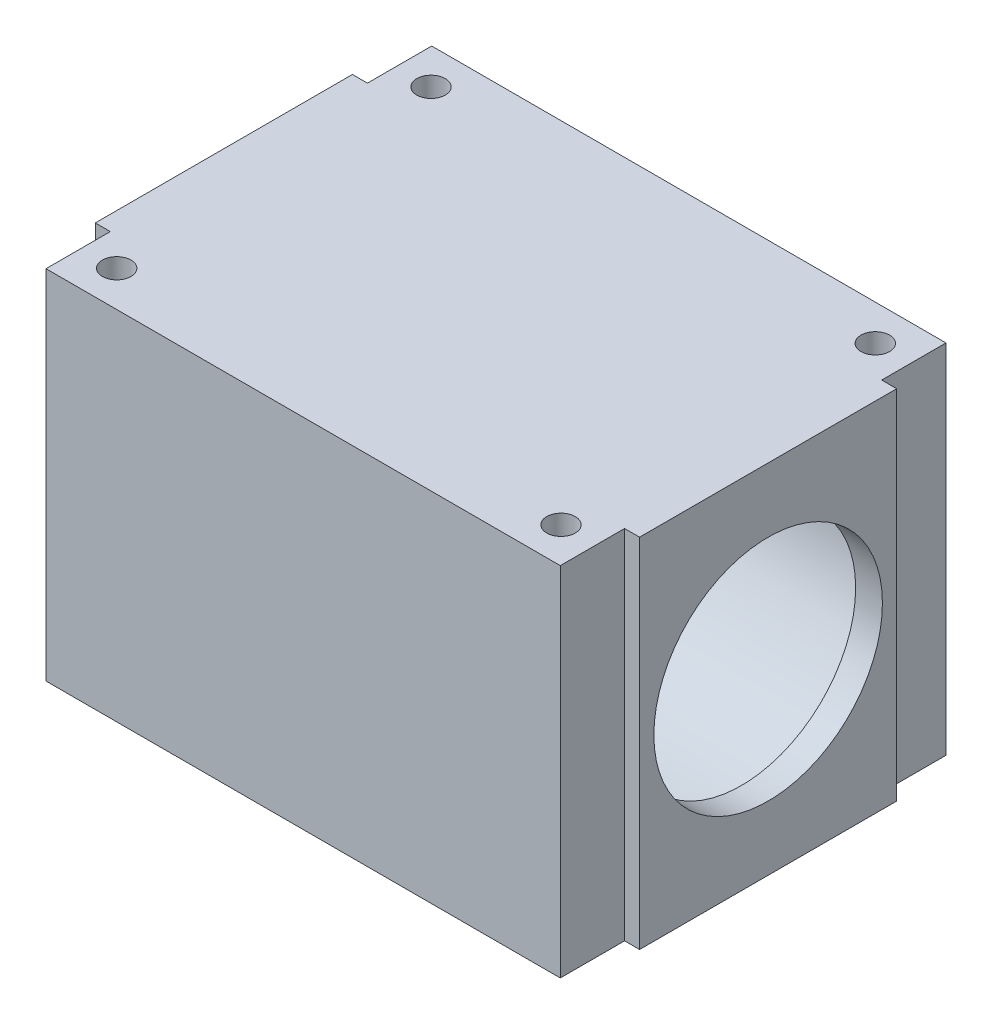
ISO-10303-21;
HEADER;
FILE_DESCRIPTION(('STEP AP214'),'2;1');
FILE_NAME('part.step','',(''),(''),'','','');
FILE_SCHEMA(('AUTOMOTIVE_DESIGN { 1 0 10303 214 1 1 1 1 }'));
ENDSEC;
DATA;
#1=APPLICATION_CONTEXT('core data for automotive mechanical design processes');
#2=APPLICATION_PROTOCOL_DEFINITION('international standard','automotive_design',2000,#1);
#3=PRODUCT_CONTEXT('',#1,'mechanical');
#4=PRODUCT('Part','Part','',(#3));
#5=PRODUCT_RELATED_PRODUCT_CATEGORY('part','',(#4));
#6=PRODUCT_DEFINITION_FORMATION('','',#4);
#7=PRODUCT_DEFINITION_CONTEXT('part definition',#1,'design');
#8=PRODUCT_DEFINITION('design','',#6,#7);
#9=PRODUCT_DEFINITION_SHAPE('','',#8);
#10=(LENGTH_UNIT() NAMED_UNIT(*) SI_UNIT(.MILLI.,.METRE.));
#11=(NAMED_UNIT(*) PLANE_ANGLE_UNIT() SI_UNIT($,.RADIAN.));
#12=(NAMED_UNIT(*) SI_UNIT($,.STERADIAN.) SOLID_ANGLE_UNIT());
#13=UNCERTAINTY_MEASURE_WITH_UNIT(LENGTH_MEASURE(1.E-05),#10,'distance_accuracy_value','');
#14=(GEOMETRIC_REPRESENTATION_CONTEXT(3) GLOBAL_UNCERTAINTY_ASSIGNED_CONTEXT((#13)) GLOBAL_UNIT_ASSIGNED_CONTEXT((#10,
#11,#12)) REPRESENTATION_CONTEXT('',''));
#15=CARTESIAN_POINT('',(0.,0.,0.));
#16=DIRECTION('',(0.,0.,1.));
#17=DIRECTION('',(1.,0.,0.));
#18=AXIS2_PLACEMENT_3D('',#15,#16,#17);
#19=CARTESIAN_POINT('',(68.2,-25.,27.));
#20=DIRECTION('',(0.,0.,-1.));
#21=DIRECTION('',(-1.,0.,0.));
#22=AXIS2_PLACEMENT_3D('',#19,#20,#21);
#23=PLANE('',#22);
#24=DIRECTION('',(0.,1.,0.));
#25=VECTOR('',#24,1.);
#26=CARTESIAN_POINT('',(-1.9,-25.,27.));
#27=LINE('',#26,#25);
#28=CARTESIAN_POINT('',(-1.9,-25.,27.));
#29=VERTEX_POINT('',#28);
#30=CARTESIAN_POINT('',(-1.9,25.,27.));
#31=VERTEX_POINT('',#30);
#32=EDGE_CURVE('E361',#29,#31,#27,.T.);
#33=ORIENTED_EDGE('',*,*,#32,.F.);
#34=DIRECTION('',(-1.,0.,0.));
#35=VECTOR('',#34,1.);
#36=CARTESIAN_POINT('',(68.2,-25.,27.));
#37=LINE('',#36,#35);
#38=CARTESIAN_POINT('',(70.1,-25.,27.));
#39=VERTEX_POINT('',#38);
#40=EDGE_CURVE('E162',#39,#29,#37,.T.);
#41=ORIENTED_EDGE('',*,*,#40,.F.);
#42=DIRECTION('',(0.,-1.,0.));
#43=VECTOR('',#42,1.);
#44=CARTESIAN_POINT('',(70.1,25.,27.));
#45=LINE('',#44,#43);
#46=CARTESIAN_POINT('',(70.1,25.,27.));
#47=VERTEX_POINT('',#46);
#48=EDGE_CURVE('E374',#47,#39,#45,.T.);
#49=ORIENTED_EDGE('',*,*,#48,.F.);
#50=DIRECTION('',(-1.,0.,0.));
#51=VECTOR('',#50,1.);
#52=CARTESIAN_POINT('',(68.2,25.,27.));
#53=LINE('',#52,#51);
#54=EDGE_CURVE('E55',#47,#31,#53,.T.);
#55=ORIENTED_EDGE('',*,*,#54,.T.);
#56=EDGE_LOOP('',(#33,#41,#49,#55));
#57=FACE_BOUND('',#56,.T.);
#58=ADVANCED_FACE('F45',(#57),#23,.F.);
#59=CARTESIAN_POINT('',(0.,0.,0.));
#60=DIRECTION('',(-1.,0.,0.));
#61=DIRECTION('',(0.,0.,1.));
#62=AXIS2_PLACEMENT_3D('',#59,#60,#61);
#63=CYLINDRICAL_SURFACE('',#62,16.);
#64=CARTESIAN_POINT('',(-4.,0.,0.));
#65=DIRECTION('',(-1.,0.,0.));
#66=DIRECTION('',(0.,0.,1.));
#67=AXIS2_PLACEMENT_3D('',#64,#65,#66);
#68=CIRCLE('',#67,16.);
#69=CARTESIAN_POINT('',(-4.,0.,16.));
#70=VERTEX_POINT('',#69);
#71=EDGE_CURVE('E205',#70,#70,#68,.T.);
#72=ORIENTED_EDGE('',*,*,#71,.T.);
#73=EDGE_LOOP('',(#72));
#74=FACE_BOUND('',#73,.T.);
#75=CARTESIAN_POINT('',(-0.25,0.,0.));
#76=DIRECTION('',(1.,0.,0.));
#77=DIRECTION('',(0.,0.,-1.));
#78=AXIS2_PLACEMENT_3D('',#75,#76,#77);
#79=CIRCLE('',#78,16.);
#80=CARTESIAN_POINT('',(-0.25,0.,-16.));
#81=VERTEX_POINT('',#80);
#82=EDGE_CURVE('E49',#81,#81,#79,.T.);
#83=ORIENTED_EDGE('',*,*,#82,.T.);
#84=EDGE_LOOP('',(#83));
#85=FACE_BOUND('',#84,.T.);
#86=ADVANCED_FACE('F313',(#74,#85),#63,.F.);
#87=CARTESIAN_POINT('',(70.2,0.,0.));
#88=DIRECTION('',(-1.,0.,0.));
#89=DIRECTION('',(0.,0.,1.));
#90=AXIS2_PLACEMENT_3D('',#87,#88,#89);
#91=CYLINDRICAL_SURFACE('',#90,16.);
#92=CARTESIAN_POINT('',(72.2,0.,0.));
#93=DIRECTION('',(1.,0.,0.));
#94=DIRECTION('',(0.,0.,-1.));
#95=AXIS2_PLACEMENT_3D('',#92,#93,#94);
#96=CIRCLE('',#95,16.);
#97=CARTESIAN_POINT('',(72.2,0.,-16.));
#98=VERTEX_POINT('',#97);
#99=EDGE_CURVE('E179',#98,#98,#96,.T.);
#100=ORIENTED_EDGE('',*,*,#99,.T.);
#101=EDGE_LOOP('',(#100));
#102=FACE_BOUND('',#101,.T.);
#103=CARTESIAN_POINT('',(68.45,0.,0.));
#104=DIRECTION('',(-1.,0.,0.));
#105=DIRECTION('',(0.,0.,1.));
#106=AXIS2_PLACEMENT_3D('',#103,#104,#105);
#107=CIRCLE('',#106,16.);
#108=CARTESIAN_POINT('',(68.45,0.,16.));
#109=VERTEX_POINT('',#108);
#110=EDGE_CURVE('E176',#109,#109,#107,.T.);
#111=ORIENTED_EDGE('',*,*,#110,.T.);
#112=EDGE_LOOP('',(#111));
#113=FACE_BOUND('',#112,.T.);
#114=ADVANCED_FACE('F319',(#102,#113),#91,.F.);
#115=CARTESIAN_POINT('',(68.2,-25.,-27.));
#116=DIRECTION('',(0.,0.,1.));
#117=DIRECTION('',(1.,0.,0.));
#118=AXIS2_PLACEMENT_3D('',#115,#116,#117);
#119=PLANE('',#118);
#120=DIRECTION('',(-1.,0.,0.));
#121=VECTOR('',#120,1.);
#122=CARTESIAN_POINT('',(68.2,-25.,-27.));
#123=LINE('',#122,#121);
#124=CARTESIAN_POINT('',(70.1,-25.,-27.));
#125=VERTEX_POINT('',#124);
#126=CARTESIAN_POINT('',(-1.9,-25.,-27.));
#127=VERTEX_POINT('',#126);
#128=EDGE_CURVE('E155',#125,#127,#123,.T.);
#129=ORIENTED_EDGE('',*,*,#128,.T.);
#130=DIRECTION('',(0.,-1.,0.));
#131=VECTOR('',#130,1.);
#132=CARTESIAN_POINT('',(-1.9,-25.,-27.));
#133=LINE('',#132,#131);
#134=CARTESIAN_POINT('',(-1.9,25.,-27.));
#135=VERTEX_POINT('',#134);
#136=EDGE_CURVE('E137',#135,#127,#133,.T.);
#137=ORIENTED_EDGE('',*,*,#136,.F.);
#138=DIRECTION('',(-1.,0.,0.));
#139=VECTOR('',#138,1.);
#140=CARTESIAN_POINT('',(68.2,25.,-27.));
#141=LINE('',#140,#139);
#142=CARTESIAN_POINT('',(70.1,25.,-27.));
#143=VERTEX_POINT('',#142);
#144=EDGE_CURVE('E11',#143,#135,#141,.T.);
#145=ORIENTED_EDGE('',*,*,#144,.F.);
#146=DIRECTION('',(0.,1.,0.));
#147=VECTOR('',#146,1.);
#148=CARTESIAN_POINT('',(70.1,25.,-27.));
#149=LINE('',#148,#147);
#150=EDGE_CURVE('E160',#125,#143,#149,.T.);
#151=ORIENTED_EDGE('',*,*,#150,.F.);
#152=EDGE_LOOP('',(#129,#137,#145,#151));
#153=FACE_BOUND('',#152,.T.);
#154=ADVANCED_FACE('F47',(#153),#119,.F.);
#155=CARTESIAN_POINT('',(68.2,25.,27.));
#156=DIRECTION('',(0.,-1.,0.));
#157=DIRECTION('',(0.,0.,-1.));
#158=AXIS2_PLACEMENT_3D('',#155,#156,#157);
#159=PLANE('',#158);
#160=CARTESIAN_POINT('',(3.,25.,-22.));
#161=DIRECTION('',(0.,-1.,0.));
#162=DIRECTION('',(0.,0.,-1.));
#163=AXIS2_PLACEMENT_3D('',#160,#161,#162);
#164=CIRCLE('',#163,2.);
#165=CARTESIAN_POINT('',(3.,25.,-24.));
#166=VERTEX_POINT('',#165);
#167=EDGE_CURVE('E217',#166,#166,#164,.T.);
#168=ORIENTED_EDGE('',*,*,#167,.T.);
#169=EDGE_LOOP('',(#168));
#170=FACE_BOUND('',#169,.T.);
#171=CARTESIAN_POINT('',(65.2,25.,-22.));
#172=DIRECTION('',(0.,-1.,0.));
#173=DIRECTION('',(0.,0.,-1.));
#174=AXIS2_PLACEMENT_3D('',#171,#172,#173);
#175=CIRCLE('',#174,2.);
#176=CARTESIAN_POINT('',(65.2,25.,-24.));
#177=VERTEX_POINT('',#176);
#178=EDGE_CURVE('E231',#177,#177,#175,.T.);
#179=ORIENTED_EDGE('',*,*,#178,.T.);
#180=EDGE_LOOP('',(#179));
#181=FACE_BOUND('',#180,.T.);
#182=CARTESIAN_POINT('',(65.2,25.,22.));
#183=DIRECTION('',(0.,-1.,0.));
#184=DIRECTION('',(0.,0.,-1.));
#185=AXIS2_PLACEMENT_3D('',#182,#183,#184);
#186=CIRCLE('',#185,2.);
#187=CARTESIAN_POINT('',(65.2,25.,20.));
#188=VERTEX_POINT('',#187);
#189=EDGE_CURVE('E223',#188,#188,#186,.T.);
#190=ORIENTED_EDGE('',*,*,#189,.T.);
#191=EDGE_LOOP('',(#190));
#192=FACE_BOUND('',#191,.T.);
#193=CARTESIAN_POINT('',(3.,25.,22.));
#194=DIRECTION('',(0.,-1.,0.));
#195=DIRECTION('',(0.,0.,-1.));
#196=AXIS2_PLACEMENT_3D('',#193,#194,#195);
#197=CIRCLE('',#196,2.);
#198=CARTESIAN_POINT('',(3.,25.,20.));
#199=VERTEX_POINT('',#198);
#200=EDGE_CURVE('E222',#199,#199,#197,.T.);
#201=ORIENTED_EDGE('',*,*,#200,.T.);
#202=EDGE_LOOP('',(#201));
#203=FACE_BOUND('',#202,.T.);
#204=DIRECTION('',(0.,0.,-1.));
#205=VECTOR('',#204,1.);
#206=CARTESIAN_POINT('',(-1.9,25.,-27.));
#207=LINE('',#206,#205);
#208=CARTESIAN_POINT('',(-1.9,25.,-18.));
#209=VERTEX_POINT('',#208);
#210=EDGE_CURVE('E143',#209,#135,#207,.T.);
#211=ORIENTED_EDGE('',*,*,#210,.F.);
#212=DIRECTION('',(-1.,0.,0.));
#213=VECTOR('',#212,1.);
#214=CARTESIAN_POINT('',(-1.9,25.,-18.));
#215=LINE('',#214,#213);
#216=CARTESIAN_POINT('',(-4.,25.,-18.));
#217=VERTEX_POINT('',#216);
#218=EDGE_CURVE('E337',#209,#217,#215,.T.);
#219=ORIENTED_EDGE('',*,*,#218,.T.);
#220=DIRECTION('',(0.,0.,-1.));
#221=VECTOR('',#220,1.);
#222=CARTESIAN_POINT('',(-4.,25.,-27.));
#223=LINE('',#222,#221);
#224=CARTESIAN_POINT('',(-4.,25.,18.));
#225=VERTEX_POINT('',#224);
#226=EDGE_CURVE('E209',#225,#217,#223,.T.);
#227=ORIENTED_EDGE('',*,*,#226,.F.);
#228=DIRECTION('',(-1.,0.,0.));
#229=VECTOR('',#228,1.);
#230=CARTESIAN_POINT('',(-1.9,25.,18.));
#231=LINE('',#230,#229);
#232=CARTESIAN_POINT('',(-1.9,25.,18.));
#233=VERTEX_POINT('',#232);
#234=EDGE_CURVE('E71',#233,#225,#231,.T.);
#235=ORIENTED_EDGE('',*,*,#234,.F.);
#236=DIRECTION('',(0.,0.,-1.));
#237=VECTOR('',#236,1.);
#238=CARTESIAN_POINT('',(-1.9,25.,27.));
#239=LINE('',#238,#237);
#240=EDGE_CURVE('E368',#31,#233,#239,.T.);
#241=ORIENTED_EDGE('',*,*,#240,.F.);
#242=ORIENTED_EDGE('',*,*,#54,.F.);
#243=DIRECTION('',(0.,0.,1.));
#244=VECTOR('',#243,1.);
#245=CARTESIAN_POINT('',(70.1,25.,27.));
#246=LINE('',#245,#244);
#247=CARTESIAN_POINT('',(70.1,25.,18.));
#248=VERTEX_POINT('',#247);
#249=EDGE_CURVE('E386',#248,#47,#246,.T.);
#250=ORIENTED_EDGE('',*,*,#249,.F.);
#251=DIRECTION('',(1.,0.,0.));
#252=VECTOR('',#251,1.);
#253=CARTESIAN_POINT('',(70.1,25.,18.));
#254=LINE('',#253,#252);
#255=CARTESIAN_POINT('',(72.2,25.,18.));
#256=VERTEX_POINT('',#255);
#257=EDGE_CURVE('E393',#248,#256,#254,.T.);
#258=ORIENTED_EDGE('',*,*,#257,.T.);
#259=DIRECTION('',(0.,0.,1.));
#260=VECTOR('',#259,1.);
#261=CARTESIAN_POINT('',(72.2,25.,27.));
#262=LINE('',#261,#260);
#263=CARTESIAN_POINT('',(72.2,25.,-18.));
#264=VERTEX_POINT('',#263);
#265=EDGE_CURVE('E186',#264,#256,#262,.T.);
#266=ORIENTED_EDGE('',*,*,#265,.F.);
#267=DIRECTION('',(1.,0.,0.));
#268=VECTOR('',#267,1.);
#269=CARTESIAN_POINT('',(70.1,25.,-18.));
#270=LINE('',#269,#268);
#271=CARTESIAN_POINT('',(70.1,25.,-18.));
#272=VERTEX_POINT('',#271);
#273=EDGE_CURVE('E399',#272,#264,#270,.T.);
#274=ORIENTED_EDGE('',*,*,#273,.F.);
#275=DIRECTION('',(0.,0.,1.));
#276=VECTOR('',#275,1.);
#277=CARTESIAN_POINT('',(70.1,25.,-27.));
#278=LINE('',#277,#276);
#279=EDGE_CURVE('E414',#143,#272,#278,.T.);
#280=ORIENTED_EDGE('',*,*,#279,.F.);
#281=ORIENTED_EDGE('',*,*,#144,.T.);
#282=EDGE_LOOP('',(#211,#219,#227,#235,#241,#242,#250,#258,#266,#274,#280,#281));
#283=FACE_BOUND('',#282,.T.);
#284=ADVANCED_FACE('F286',(#170,#181,#192,#203,#283),#159,.F.);
#285=CARTESIAN_POINT('',(68.2,-25.,27.));
#286=DIRECTION('',(0.,1.,0.));
#287=DIRECTION('',(0.,0.,1.));
#288=AXIS2_PLACEMENT_3D('',#285,#286,#287);
#289=PLANE('',#288);
#290=CARTESIAN_POINT('',(3.,-25.,-22.));
#291=DIRECTION('',(0.,-1.,0.));
#292=DIRECTION('',(0.,0.,-1.));
#293=AXIS2_PLACEMENT_3D('',#290,#291,#292);
#294=CIRCLE('',#293,2.);
#295=CARTESIAN_POINT('',(3.,-25.,-24.));
#296=VERTEX_POINT('',#295);
#297=EDGE_CURVE('E266',#296,#296,#294,.T.);
#298=ORIENTED_EDGE('',*,*,#297,.F.);
#299=EDGE_LOOP('',(#298));
#300=FACE_BOUND('',#299,.T.);
#301=CARTESIAN_POINT('',(65.2,-25.,-22.));
#302=DIRECTION('',(0.,-1.,0.));
#303=DIRECTION('',(0.,0.,-1.));
#304=AXIS2_PLACEMENT_3D('',#301,#302,#303);
#305=CIRCLE('',#304,2.);
#306=CARTESIAN_POINT('',(65.2,-25.,-24.));
#307=VERTEX_POINT('',#306);
#308=EDGE_CURVE('E258',#307,#307,#305,.T.);
#309=ORIENTED_EDGE('',*,*,#308,.F.);
#310=EDGE_LOOP('',(#309));
#311=FACE_BOUND('',#310,.T.);
#312=CARTESIAN_POINT('',(65.2,-25.,22.));
#313=DIRECTION('',(0.,-1.,0.));
#314=DIRECTION('',(0.,0.,-1.));
#315=AXIS2_PLACEMENT_3D('',#312,#313,#314);
#316=CIRCLE('',#315,2.);
#317=CARTESIAN_POINT('',(65.2,-25.,20.));
#318=VERTEX_POINT('',#317);
#319=EDGE_CURVE('E250',#318,#318,#316,.T.);
#320=ORIENTED_EDGE('',*,*,#319,.F.);
#321=EDGE_LOOP('',(#320));
#322=FACE_BOUND('',#321,.T.);
#323=CARTESIAN_POINT('',(3.,-25.,22.));
#324=DIRECTION('',(0.,-1.,0.));
#325=DIRECTION('',(0.,0.,-1.));
#326=AXIS2_PLACEMENT_3D('',#323,#324,#325);
#327=CIRCLE('',#326,2.);
#328=CARTESIAN_POINT('',(3.,-25.,20.));
#329=VERTEX_POINT('',#328);
#330=EDGE_CURVE('E170',#329,#329,#327,.T.);
#331=ORIENTED_EDGE('',*,*,#330,.F.);
#332=EDGE_LOOP('',(#331));
#333=FACE_BOUND('',#332,.T.);
#334=DIRECTION('',(0.,0.,1.));
#335=VECTOR('',#334,1.);
#336=CARTESIAN_POINT('',(-4.,-25.,-27.));
#337=LINE('',#336,#335);
#338=CARTESIAN_POINT('',(-4.,-25.,-18.));
#339=VERTEX_POINT('',#338);
#340=CARTESIAN_POINT('',(-4.,-25.,18.));
#341=VERTEX_POINT('',#340);
#342=EDGE_CURVE('E213',#339,#341,#337,.T.);
#343=ORIENTED_EDGE('',*,*,#342,.F.);
#344=DIRECTION('',(-1.,0.,0.));
#345=VECTOR('',#344,1.);
#346=CARTESIAN_POINT('',(-1.9,-25.,-18.));
#347=LINE('',#346,#345);
#348=CARTESIAN_POINT('',(-1.9,-25.,-18.));
#349=VERTEX_POINT('',#348);
#350=EDGE_CURVE('E63',#349,#339,#347,.T.);
#351=ORIENTED_EDGE('',*,*,#350,.F.);
#352=DIRECTION('',(0.,0.,1.));
#353=VECTOR('',#352,1.);
#354=CARTESIAN_POINT('',(-1.9,-25.,-27.));
#355=LINE('',#354,#353);
#356=EDGE_CURVE('E141',#127,#349,#355,.T.);
#357=ORIENTED_EDGE('',*,*,#356,.F.);
#358=ORIENTED_EDGE('',*,*,#128,.F.);
#359=DIRECTION('',(0.,0.,-1.));
#360=VECTOR('',#359,1.);
#361=CARTESIAN_POINT('',(70.1,-25.,-27.));
#362=LINE('',#361,#360);
#363=CARTESIAN_POINT('',(70.1,-25.,-18.));
#364=VERTEX_POINT('',#363);
#365=EDGE_CURVE('E402',#364,#125,#362,.T.);
#366=ORIENTED_EDGE('',*,*,#365,.F.);
#367=DIRECTION('',(1.,0.,0.));
#368=VECTOR('',#367,1.);
#369=CARTESIAN_POINT('',(70.1,-25.,-18.));
#370=LINE('',#369,#368);
#371=CARTESIAN_POINT('',(72.2,-25.,-18.));
#372=VERTEX_POINT('',#371);
#373=EDGE_CURVE('E350',#364,#372,#370,.T.);
#374=ORIENTED_EDGE('',*,*,#373,.T.);
#375=DIRECTION('',(0.,0.,-1.));
#376=VECTOR('',#375,1.);
#377=CARTESIAN_POINT('',(72.2,-25.,27.));
#378=LINE('',#377,#376);
#379=CARTESIAN_POINT('',(72.2,-25.,18.));
#380=VERTEX_POINT('',#379);
#381=EDGE_CURVE('E201',#380,#372,#378,.T.);
#382=ORIENTED_EDGE('',*,*,#381,.F.);
#383=DIRECTION('',(1.,0.,0.));
#384=VECTOR('',#383,1.);
#385=CARTESIAN_POINT('',(70.1,-25.,18.));
#386=LINE('',#385,#384);
#387=CARTESIAN_POINT('',(70.1,-25.,18.));
#388=VERTEX_POINT('',#387);
#389=EDGE_CURVE('E389',#388,#380,#386,.T.);
#390=ORIENTED_EDGE('',*,*,#389,.F.);
#391=DIRECTION('',(0.,0.,-1.));
#392=VECTOR('',#391,1.);
#393=CARTESIAN_POINT('',(70.1,-25.,27.));
#394=LINE('',#393,#392);
#395=EDGE_CURVE('E377',#39,#388,#394,.T.);
#396=ORIENTED_EDGE('',*,*,#395,.F.);
#397=ORIENTED_EDGE('',*,*,#40,.T.);
#398=DIRECTION('',(0.,0.,1.));
#399=VECTOR('',#398,1.);
#400=CARTESIAN_POINT('',(-1.9,-25.,27.));
#401=LINE('',#400,#399);
#402=CARTESIAN_POINT('',(-1.9,-25.,18.));
#403=VERTEX_POINT('',#402);
#404=EDGE_CURVE('E354',#403,#29,#401,.T.);
#405=ORIENTED_EDGE('',*,*,#404,.F.);
#406=DIRECTION('',(-1.,0.,0.));
#407=VECTOR('',#406,1.);
#408=CARTESIAN_POINT('',(-1.9,-25.,18.));
#409=LINE('',#408,#407);
#410=EDGE_CURVE('E355',#403,#341,#409,.T.);
#411=ORIENTED_EDGE('',*,*,#410,.T.);
#412=EDGE_LOOP('',(#343,#351,#357,#358,#366,#374,#382,#390,#396,#397,#405,#411));
#413=FACE_BOUND('',#412,.T.);
#414=ADVANCED_FACE('F153',(#300,#311,#322,#333,#413),#289,.F.);
#415=CARTESIAN_POINT('',(68.2,0.,0.));
#416=DIRECTION('',(-1.,0.,0.));
#417=DIRECTION('',(0.,0.,1.));
#418=AXIS2_PLACEMENT_3D('',#415,#416,#417);
#419=CYLINDRICAL_SURFACE('',#418,23.9);
#420=CARTESIAN_POINT('',(68.45,0.,0.));
#421=DIRECTION('',(-1.,0.,0.));
#422=DIRECTION('',(0.,0.,1.));
#423=AXIS2_PLACEMENT_3D('',#420,#421,#422);
#424=CIRCLE('',#423,23.9);
#425=CARTESIAN_POINT('',(68.45,0.,23.9));
#426=VERTEX_POINT('',#425);
#427=EDGE_CURVE('E180',#426,#426,#424,.T.);
#428=ORIENTED_EDGE('',*,*,#427,.F.);
#429=EDGE_LOOP('',(#428));
#430=FACE_BOUND('',#429,.T.);
#431=CARTESIAN_POINT('',(-0.25,0.,0.));
#432=DIRECTION('',(1.,0.,0.));
#433=DIRECTION('',(0.,0.,-1.));
#434=AXIS2_PLACEMENT_3D('',#431,#432,#433);
#435=CIRCLE('',#434,23.9);
#436=CARTESIAN_POINT('',(-0.25,0.,-23.9));
#437=VERTEX_POINT('',#436);
#438=EDGE_CURVE('E194',#437,#437,#435,.T.);
#439=ORIENTED_EDGE('',*,*,#438,.F.);
#440=EDGE_LOOP('',(#439));
#441=FACE_BOUND('',#440,.T.);
#442=ADVANCED_FACE('F285',(#430,#441),#419,.F.);
#443=CARTESIAN_POINT('',(3.,-18.,22.));
#444=DIRECTION('',(0.,-1.,0.));
#445=DIRECTION('',(0.,0.,-1.));
#446=AXIS2_PLACEMENT_3D('',#443,#444,#445);
#447=CYLINDRICAL_SURFACE('',#446,2.);
#448=CARTESIAN_POINT('',(3.,-18.,22.));
#449=DIRECTION('',(0.,-1.,0.));
#450=DIRECTION('',(0.,0.,-1.));
#451=AXIS2_PLACEMENT_3D('',#448,#449,#450);
#452=CIRCLE('',#451,2.);
#453=CARTESIAN_POINT('',(3.,-18.,20.));
#454=VERTEX_POINT('',#453);
#455=EDGE_CURVE('E163',#454,#454,#452,.T.);
#456=ORIENTED_EDGE('',*,*,#455,.F.);
#457=EDGE_LOOP('',(#456));
#458=FACE_BOUND('',#457,.T.);
#459=ORIENTED_EDGE('',*,*,#330,.T.);
#460=EDGE_LOOP('',(#459));
#461=FACE_BOUND('',#460,.T.);
#462=ADVANCED_FACE('F296',(#458,#461),#447,.F.);
#463=CARTESIAN_POINT('',(3.,-18.,22.));
#464=DIRECTION('',(0.,-1.,0.));
#465=DIRECTION('',(0.,0.,-1.));
#466=AXIS2_PLACEMENT_3D('',#463,#464,#465);
#467=PLANE('',#466);
#468=ORIENTED_EDGE('',*,*,#455,.T.);
#469=EDGE_LOOP('',(#468));
#470=FACE_BOUND('',#469,.T.);
#471=ADVANCED_FACE('F298',(#470),#467,.T.);
#472=CARTESIAN_POINT('',(65.2,-18.,22.));
#473=DIRECTION('',(0.,-1.,0.));
#474=DIRECTION('',(0.,0.,-1.));
#475=AXIS2_PLACEMENT_3D('',#472,#473,#474);
#476=CYLINDRICAL_SURFACE('',#475,2.);
#477=CARTESIAN_POINT('',(65.2,-18.,22.));
#478=DIRECTION('',(0.,-1.,0.));
#479=DIRECTION('',(0.,0.,-1.));
#480=AXIS2_PLACEMENT_3D('',#477,#478,#479);
#481=CIRCLE('',#480,2.);
#482=CARTESIAN_POINT('',(65.2,-18.,20.));
#483=VERTEX_POINT('',#482);
#484=EDGE_CURVE('E254',#483,#483,#481,.T.);
#485=ORIENTED_EDGE('',*,*,#484,.F.);
#486=EDGE_LOOP('',(#485));
#487=FACE_BOUND('',#486,.T.);
#488=ORIENTED_EDGE('',*,*,#319,.T.);
#489=EDGE_LOOP('',(#488));
#490=FACE_BOUND('',#489,.T.);
#491=ADVANCED_FACE('F305',(#487,#490),#476,.F.);
#492=CARTESIAN_POINT('',(65.2,-18.,22.));
#493=DIRECTION('',(0.,-1.,0.));
#494=DIRECTION('',(0.,0.,-1.));
#495=AXIS2_PLACEMENT_3D('',#492,#493,#494);
#496=PLANE('',#495);
#497=ORIENTED_EDGE('',*,*,#484,.T.);
#498=EDGE_LOOP('',(#497));
#499=FACE_BOUND('',#498,.T.);
#500=ADVANCED_FACE('F514',(#499),#496,.T.);
#501=CARTESIAN_POINT('',(65.2,-18.,-22.));
#502=DIRECTION('',(0.,-1.,0.));
#503=DIRECTION('',(0.,0.,-1.));
#504=AXIS2_PLACEMENT_3D('',#501,#502,#503);
#505=CYLINDRICAL_SURFACE('',#504,2.);
#506=CARTESIAN_POINT('',(65.2,-18.,-22.));
#507=DIRECTION('',(0.,-1.,0.));
#508=DIRECTION('',(0.,0.,-1.));
#509=AXIS2_PLACEMENT_3D('',#506,#507,#508);
#510=CIRCLE('',#509,2.);
#511=CARTESIAN_POINT('',(65.2,-18.,-24.));
#512=VERTEX_POINT('',#511);
#513=EDGE_CURVE('E262',#512,#512,#510,.T.);
#514=ORIENTED_EDGE('',*,*,#513,.F.);
#515=EDGE_LOOP('',(#514));
#516=FACE_BOUND('',#515,.T.);
#517=ORIENTED_EDGE('',*,*,#308,.T.);
#518=EDGE_LOOP('',(#517));
#519=FACE_BOUND('',#518,.T.);
#520=ADVANCED_FACE('F518',(#516,#519),#505,.F.);
#521=CARTESIAN_POINT('',(65.2,-18.,-22.));
#522=DIRECTION('',(0.,-1.,0.));
#523=DIRECTION('',(0.,0.,-1.));
#524=AXIS2_PLACEMENT_3D('',#521,#522,#523);
#525=PLANE('',#524);
#526=ORIENTED_EDGE('',*,*,#513,.T.);
#527=EDGE_LOOP('',(#526));
#528=FACE_BOUND('',#527,.T.);
#529=ADVANCED_FACE('F279',(#528),#525,.T.);
#530=CARTESIAN_POINT('',(3.,-18.,-22.));
#531=DIRECTION('',(0.,-1.,0.));
#532=DIRECTION('',(0.,0.,-1.));
#533=AXIS2_PLACEMENT_3D('',#530,#531,#532);
#534=CYLINDRICAL_SURFACE('',#533,2.);
#535=CARTESIAN_POINT('',(3.,-18.,-22.));
#536=DIRECTION('',(0.,-1.,0.));
#537=DIRECTION('',(0.,0.,-1.));
#538=AXIS2_PLACEMENT_3D('',#535,#536,#537);
#539=CIRCLE('',#538,2.);
#540=CARTESIAN_POINT('',(3.,-18.,-24.));
#541=VERTEX_POINT('',#540);
#542=EDGE_CURVE('E246',#541,#541,#539,.T.);
#543=ORIENTED_EDGE('',*,*,#542,.F.);
#544=EDGE_LOOP('',(#543));
#545=FACE_BOUND('',#544,.T.);
#546=ORIENTED_EDGE('',*,*,#297,.T.);
#547=EDGE_LOOP('',(#546));
#548=FACE_BOUND('',#547,.T.);
#549=ADVANCED_FACE('F276',(#545,#548),#534,.F.);
#550=CARTESIAN_POINT('',(3.,-18.,-22.));
#551=DIRECTION('',(0.,-1.,0.));
#552=DIRECTION('',(0.,0.,-1.));
#553=AXIS2_PLACEMENT_3D('',#550,#551,#552);
#554=PLANE('',#553);
#555=ORIENTED_EDGE('',*,*,#542,.T.);
#556=EDGE_LOOP('',(#555));
#557=FACE_BOUND('',#556,.T.);
#558=ADVANCED_FACE('F274',(#557),#554,.T.);
#559=CARTESIAN_POINT('',(3.,18.,22.));
#560=DIRECTION('',(0.,1.,0.));
#561=DIRECTION('',(0.,0.,1.));
#562=AXIS2_PLACEMENT_3D('',#559,#560,#561);
#563=CYLINDRICAL_SURFACE('',#562,2.);
#564=CARTESIAN_POINT('',(3.,18.,22.));
#565=DIRECTION('',(0.,-1.,0.));
#566=DIRECTION('',(0.,0.,-1.));
#567=AXIS2_PLACEMENT_3D('',#564,#565,#566);
#568=CIRCLE('',#567,2.);
#569=CARTESIAN_POINT('',(3.,18.,20.));
#570=VERTEX_POINT('',#569);
#571=EDGE_CURVE('E242',#570,#570,#568,.T.);
#572=ORIENTED_EDGE('',*,*,#571,.T.);
#573=EDGE_LOOP('',(#572));
#574=FACE_BOUND('',#573,.T.);
#575=ORIENTED_EDGE('',*,*,#200,.F.);
#576=EDGE_LOOP('',(#575));
#577=FACE_BOUND('',#576,.T.);
#578=ADVANCED_FACE('F507',(#574,#577),#563,.F.);
#579=CARTESIAN_POINT('',(3.,18.,22.));
#580=DIRECTION('',(0.,1.,0.));
#581=DIRECTION('',(0.,0.,-1.));
#582=AXIS2_PLACEMENT_3D('',#579,#580,#581);
#583=PLANE('',#582);
#584=ORIENTED_EDGE('',*,*,#571,.F.);
#585=EDGE_LOOP('',(#584));
#586=FACE_BOUND('',#585,.T.);
#587=ADVANCED_FACE('F489',(#586),#583,.T.);
#588=CARTESIAN_POINT('',(65.2,18.,22.));
#589=DIRECTION('',(0.,1.,0.));
#590=DIRECTION('',(0.,0.,1.));
#591=AXIS2_PLACEMENT_3D('',#588,#589,#590);
#592=CYLINDRICAL_SURFACE('',#591,2.);
#593=CARTESIAN_POINT('',(65.2,18.,22.));
#594=DIRECTION('',(0.,-1.,0.));
#595=DIRECTION('',(0.,0.,-1.));
#596=AXIS2_PLACEMENT_3D('',#593,#594,#595);
#597=CIRCLE('',#596,2.);
#598=CARTESIAN_POINT('',(65.2,18.,20.));
#599=VERTEX_POINT('',#598);
#600=EDGE_CURVE('E218',#599,#599,#597,.T.);
#601=ORIENTED_EDGE('',*,*,#600,.T.);
#602=EDGE_LOOP('',(#601));
#603=FACE_BOUND('',#602,.T.);
#604=ORIENTED_EDGE('',*,*,#189,.F.);
#605=EDGE_LOOP('',(#604));
#606=FACE_BOUND('',#605,.T.);
#607=ADVANCED_FACE('F485',(#603,#606),#592,.F.);
#608=CARTESIAN_POINT('',(65.2,18.,22.));
#609=DIRECTION('',(0.,1.,0.));
#610=DIRECTION('',(0.,0.,-1.));
#611=AXIS2_PLACEMENT_3D('',#608,#609,#610);
#612=PLANE('',#611);
#613=ORIENTED_EDGE('',*,*,#600,.F.);
#614=EDGE_LOOP('',(#613));
#615=FACE_BOUND('',#614,.T.);
#616=ADVANCED_FACE('F481',(#615),#612,.T.);
#617=CARTESIAN_POINT('',(65.2,18.,-22.));
#618=DIRECTION('',(0.,1.,0.));
#619=DIRECTION('',(0.,0.,1.));
#620=AXIS2_PLACEMENT_3D('',#617,#618,#619);
#621=CYLINDRICAL_SURFACE('',#620,2.);
#622=CARTESIAN_POINT('',(65.2,18.,-22.));
#623=DIRECTION('',(0.,-1.,0.));
#624=DIRECTION('',(0.,0.,-1.));
#625=AXIS2_PLACEMENT_3D('',#622,#623,#624);
#626=CIRCLE('',#625,2.);
#627=CARTESIAN_POINT('',(65.2,18.,-24.));
#628=VERTEX_POINT('',#627);
#629=EDGE_CURVE('E227',#628,#628,#626,.T.);
#630=ORIENTED_EDGE('',*,*,#629,.T.);
#631=EDGE_LOOP('',(#630));
#632=FACE_BOUND('',#631,.T.);
#633=ORIENTED_EDGE('',*,*,#178,.F.);
#634=EDGE_LOOP('',(#633));
#635=FACE_BOUND('',#634,.T.);
#636=ADVANCED_FACE('F484',(#632,#635),#621,.F.);
#637=CARTESIAN_POINT('',(65.2,18.,-22.));
#638=DIRECTION('',(0.,1.,0.));
#639=DIRECTION('',(0.,0.,-1.));
#640=AXIS2_PLACEMENT_3D('',#637,#638,#639);
#641=PLANE('',#640);
#642=ORIENTED_EDGE('',*,*,#629,.F.);
#643=EDGE_LOOP('',(#642));
#644=FACE_BOUND('',#643,.T.);
#645=ADVANCED_FACE('F491',(#644),#641,.T.);
#646=CARTESIAN_POINT('',(3.,18.,-22.));
#647=DIRECTION('',(0.,1.,0.));
#648=DIRECTION('',(0.,0.,1.));
#649=AXIS2_PLACEMENT_3D('',#646,#647,#648);
#650=CYLINDRICAL_SURFACE('',#649,2.);
#651=CARTESIAN_POINT('',(3.,18.,-22.));
#652=DIRECTION('',(0.,-1.,0.));
#653=DIRECTION('',(0.,0.,-1.));
#654=AXIS2_PLACEMENT_3D('',#651,#652,#653);
#655=CIRCLE('',#654,2.);
#656=CARTESIAN_POINT('',(3.,18.,-24.));
#657=VERTEX_POINT('',#656);
#658=EDGE_CURVE('E235',#657,#657,#655,.T.);
#659=ORIENTED_EDGE('',*,*,#658,.T.);
#660=EDGE_LOOP('',(#659));
#661=FACE_BOUND('',#660,.T.);
#662=ORIENTED_EDGE('',*,*,#167,.F.);
#663=EDGE_LOOP('',(#662));
#664=FACE_BOUND('',#663,.T.);
#665=ADVANCED_FACE('F494',(#661,#664),#650,.F.);
#666=CARTESIAN_POINT('',(3.,18.,-22.));
#667=DIRECTION('',(0.,1.,0.));
#668=DIRECTION('',(0.,0.,-1.));
#669=AXIS2_PLACEMENT_3D('',#666,#667,#668);
#670=PLANE('',#669);
#671=ORIENTED_EDGE('',*,*,#658,.F.);
#672=EDGE_LOOP('',(#671));
#673=FACE_BOUND('',#672,.T.);
#674=ADVANCED_FACE('F480',(#673),#670,.T.);
#675=CARTESIAN_POINT('',(-4.,0.,0.));
#676=DIRECTION('',(1.,0.,0.));
#677=DIRECTION('',(0.,0.,-1.));
#678=AXIS2_PLACEMENT_3D('',#675,#676,#677);
#679=PLANE('',#678);
#680=ORIENTED_EDGE('',*,*,#226,.T.);
#681=DIRECTION('',(0.,1.,0.));
#682=VECTOR('',#681,1.);
#683=CARTESIAN_POINT('',(-4.,-25.,-18.));
#684=LINE('',#683,#682);
#685=EDGE_CURVE('E148',#339,#217,#684,.T.);
#686=ORIENTED_EDGE('',*,*,#685,.F.);
#687=ORIENTED_EDGE('',*,*,#342,.T.);
#688=DIRECTION('',(0.,-1.,0.));
#689=VECTOR('',#688,1.);
#690=CARTESIAN_POINT('',(-4.,-25.,18.));
#691=LINE('',#690,#689);
#692=EDGE_CURVE('E348',#225,#341,#691,.T.);
#693=ORIENTED_EDGE('',*,*,#692,.F.);
#694=EDGE_LOOP('',(#680,#686,#687,#693));
#695=FACE_BOUND('',#694,.T.);
#696=ORIENTED_EDGE('',*,*,#71,.F.);
#697=EDGE_LOOP('',(#696));
#698=FACE_BOUND('',#697,.T.);
#699=ADVANCED_FACE('F445',(#695,#698),#679,.F.);
#700=CARTESIAN_POINT('',(72.2,0.,0.));
#701=DIRECTION('',(-1.,0.,0.));
#702=DIRECTION('',(0.,0.,1.));
#703=AXIS2_PLACEMENT_3D('',#700,#701,#702);
#704=PLANE('',#703);
#705=ORIENTED_EDGE('',*,*,#265,.T.);
#706=DIRECTION('',(0.,1.,0.));
#707=VECTOR('',#706,1.);
#708=CARTESIAN_POINT('',(72.2,25.,18.));
#709=LINE('',#708,#707);
#710=EDGE_CURVE('E378',#380,#256,#709,.T.);
#711=ORIENTED_EDGE('',*,*,#710,.F.);
#712=ORIENTED_EDGE('',*,*,#381,.T.);
#713=DIRECTION('',(0.,-1.,0.));
#714=VECTOR('',#713,1.);
#715=CARTESIAN_POINT('',(72.2,25.,-18.));
#716=LINE('',#715,#714);
#717=EDGE_CURVE('E392',#264,#372,#716,.T.);
#718=ORIENTED_EDGE('',*,*,#717,.F.);
#719=EDGE_LOOP('',(#705,#711,#712,#718));
#720=FACE_BOUND('',#719,.T.);
#721=ORIENTED_EDGE('',*,*,#99,.F.);
#722=EDGE_LOOP('',(#721));
#723=FACE_BOUND('',#722,.T.);
#724=ADVANCED_FACE('F426',(#720,#723),#704,.F.);
#725=CARTESIAN_POINT('',(68.45,0.,0.));
#726=DIRECTION('',(-1.,0.,0.));
#727=DIRECTION('',(0.,0.,1.));
#728=AXIS2_PLACEMENT_3D('',#725,#726,#727);
#729=PLANE('',#728);
#730=ORIENTED_EDGE('',*,*,#110,.F.);
#731=EDGE_LOOP('',(#730));
#732=FACE_BOUND('',#731,.T.);
#733=ORIENTED_EDGE('',*,*,#427,.T.);
#734=EDGE_LOOP('',(#733));
#735=FACE_BOUND('',#734,.T.);
#736=ADVANCED_FACE('F471',(#732,#735),#729,.T.);
#737=CARTESIAN_POINT('',(-0.25,0.,0.));
#738=DIRECTION('',(1.,0.,0.));
#739=DIRECTION('',(0.,0.,-1.));
#740=AXIS2_PLACEMENT_3D('',#737,#738,#739);
#741=PLANE('',#740);
#742=ORIENTED_EDGE('',*,*,#82,.F.);
#743=EDGE_LOOP('',(#742));
#744=FACE_BOUND('',#743,.T.);
#745=ORIENTED_EDGE('',*,*,#438,.T.);
#746=EDGE_LOOP('',(#745));
#747=FACE_BOUND('',#746,.T.);
#748=ADVANCED_FACE('F466',(#744,#747),#741,.T.);
#749=CARTESIAN_POINT('',(70.1,25.,-18.));
#750=DIRECTION('',(0.,0.,1.));
#751=DIRECTION('',(0.,-1.,0.));
#752=AXIS2_PLACEMENT_3D('',#749,#750,#751);
#753=PLANE('',#752);
#754=ORIENTED_EDGE('',*,*,#717,.T.);
#755=ORIENTED_EDGE('',*,*,#373,.F.);
#756=DIRECTION('',(0.,-1.,0.));
#757=VECTOR('',#756,1.);
#758=CARTESIAN_POINT('',(70.1,25.,-18.));
#759=LINE('',#758,#757);
#760=EDGE_CURVE('E410',#272,#364,#759,.T.);
#761=ORIENTED_EDGE('',*,*,#760,.F.);
#762=ORIENTED_EDGE('',*,*,#273,.T.);
#763=EDGE_LOOP('',(#754,#755,#761,#762));
#764=FACE_BOUND('',#763,.T.);
#765=ADVANCED_FACE('F424',(#764),#753,.F.);
#766=CARTESIAN_POINT('',(70.1,0.,0.));
#767=DIRECTION('',(-1.,0.,0.));
#768=DIRECTION('',(0.,0.,1.));
#769=AXIS2_PLACEMENT_3D('',#766,#767,#768);
#770=PLANE('',#769);
#771=ORIENTED_EDGE('',*,*,#150,.T.);
#772=ORIENTED_EDGE('',*,*,#279,.T.);
#773=ORIENTED_EDGE('',*,*,#760,.T.);
#774=ORIENTED_EDGE('',*,*,#365,.T.);
#775=EDGE_LOOP('',(#771,#772,#773,#774));
#776=FACE_BOUND('',#775,.T.);
#777=ADVANCED_FACE('F419',(#776),#770,.F.);
#778=CARTESIAN_POINT('',(70.1,25.,18.));
#779=DIRECTION('',(0.,0.,-1.));
#780=DIRECTION('',(0.,1.,0.));
#781=AXIS2_PLACEMENT_3D('',#778,#779,#780);
#782=PLANE('',#781);
#783=ORIENTED_EDGE('',*,*,#710,.T.);
#784=ORIENTED_EDGE('',*,*,#257,.F.);
#785=DIRECTION('',(0.,1.,0.));
#786=VECTOR('',#785,1.);
#787=CARTESIAN_POINT('',(70.1,25.,18.));
#788=LINE('',#787,#786);
#789=EDGE_CURVE('E382',#388,#248,#788,.T.);
#790=ORIENTED_EDGE('',*,*,#789,.F.);
#791=ORIENTED_EDGE('',*,*,#389,.T.);
#792=EDGE_LOOP('',(#783,#784,#790,#791));
#793=FACE_BOUND('',#792,.T.);
#794=ADVANCED_FACE('F434',(#793),#782,.F.);
#795=CARTESIAN_POINT('',(70.1,0.,0.));
#796=DIRECTION('',(1.,0.,0.));
#797=DIRECTION('',(0.,0.,-1.));
#798=AXIS2_PLACEMENT_3D('',#795,#796,#797);
#799=PLANE('',#798);
#800=ORIENTED_EDGE('',*,*,#48,.T.);
#801=ORIENTED_EDGE('',*,*,#395,.T.);
#802=ORIENTED_EDGE('',*,*,#789,.T.);
#803=ORIENTED_EDGE('',*,*,#249,.T.);
#804=EDGE_LOOP('',(#800,#801,#802,#803));
#805=FACE_BOUND('',#804,.T.);
#806=ADVANCED_FACE('F437',(#805),#799,.T.);
#807=CARTESIAN_POINT('',(-1.9,-25.,18.));
#808=DIRECTION('',(0.,0.,-1.));
#809=DIRECTION('',(-1.,0.,0.));
#810=AXIS2_PLACEMENT_3D('',#807,#808,#809);
#811=PLANE('',#810);
#812=ORIENTED_EDGE('',*,*,#692,.T.);
#813=ORIENTED_EDGE('',*,*,#410,.F.);
#814=DIRECTION('',(0.,-1.,0.));
#815=VECTOR('',#814,1.);
#816=CARTESIAN_POINT('',(-1.9,-25.,18.));
#817=LINE('',#816,#815);
#818=EDGE_CURVE('E364',#233,#403,#817,.T.);
#819=ORIENTED_EDGE('',*,*,#818,.F.);
#820=ORIENTED_EDGE('',*,*,#234,.T.);
#821=EDGE_LOOP('',(#812,#813,#819,#820));
#822=FACE_BOUND('',#821,.T.);
#823=ADVANCED_FACE('F455',(#822),#811,.F.);
#824=CARTESIAN_POINT('',(-1.9,0.,0.));
#825=DIRECTION('',(-1.,0.,0.));
#826=DIRECTION('',(0.,0.,1.));
#827=AXIS2_PLACEMENT_3D('',#824,#825,#826);
#828=PLANE('',#827);
#829=ORIENTED_EDGE('',*,*,#32,.T.);
#830=ORIENTED_EDGE('',*,*,#240,.T.);
#831=ORIENTED_EDGE('',*,*,#818,.T.);
#832=ORIENTED_EDGE('',*,*,#404,.T.);
#833=EDGE_LOOP('',(#829,#830,#831,#832));
#834=FACE_BOUND('',#833,.T.);
#835=ADVANCED_FACE('F442',(#834),#828,.T.);
#836=CARTESIAN_POINT('',(-1.9,-25.,-18.));
#837=DIRECTION('',(0.,0.,1.));
#838=DIRECTION('',(1.,0.,0.));
#839=AXIS2_PLACEMENT_3D('',#836,#837,#838);
#840=PLANE('',#839);
#841=ORIENTED_EDGE('',*,*,#685,.T.);
#842=ORIENTED_EDGE('',*,*,#218,.F.);
#843=DIRECTION('',(0.,1.,0.));
#844=VECTOR('',#843,1.);
#845=CARTESIAN_POINT('',(-1.9,-25.,-18.));
#846=LINE('',#845,#844);
#847=EDGE_CURVE('E157',#349,#209,#846,.T.);
#848=ORIENTED_EDGE('',*,*,#847,.F.);
#849=ORIENTED_EDGE('',*,*,#350,.T.);
#850=EDGE_LOOP('',(#841,#842,#848,#849));
#851=FACE_BOUND('',#850,.T.);
#852=ADVANCED_FACE('F447',(#851),#840,.F.);
#853=CARTESIAN_POINT('',(-1.9,0.,0.));
#854=DIRECTION('',(1.,0.,0.));
#855=DIRECTION('',(0.,0.,-1.));
#856=AXIS2_PLACEMENT_3D('',#853,#854,#855);
#857=PLANE('',#856);
#858=ORIENTED_EDGE('',*,*,#136,.T.);
#859=ORIENTED_EDGE('',*,*,#356,.T.);
#860=ORIENTED_EDGE('',*,*,#847,.T.);
#861=ORIENTED_EDGE('',*,*,#210,.T.);
#862=EDGE_LOOP('',(#858,#859,#860,#861));
#863=FACE_BOUND('',#862,.T.);
#864=ADVANCED_FACE('F139',(#863),#857,.F.);
#865=CLOSED_SHELL('',(#58,#86,#114,#154,#284,#414,#442,#462,#471,#491,#500,#520,#529,#549,#558,
#578,#587,#607,#616,#636,#645,#665,#674,#699,#724,#736,#748,#765,#777,#794,#806,#823,#835,#852,#864));
#866=MANIFOLD_SOLID_BREP('B2',#865);
#867=ADVANCED_BREP_SHAPE_REPRESENTATION('',(#18,#866),#14);
#868=SHAPE_DEFINITION_REPRESENTATION(#9,#867);
ENDSEC;
END-ISO-10303-21;
